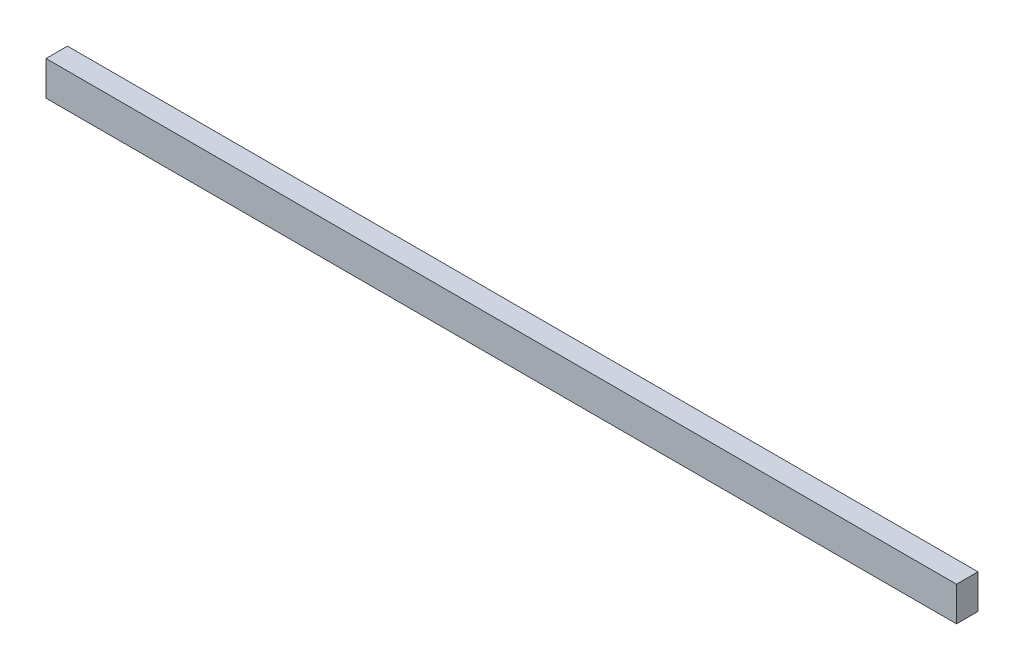
ISO-10303-21;
HEADER;
FILE_DESCRIPTION(('STEP AP214'),'2;1');
FILE_NAME('part.step','',(''),(''),'','','');
FILE_SCHEMA(('AUTOMOTIVE_DESIGN { 1 0 10303 214 1 1 1 1 }'));
ENDSEC;
DATA;
#1=APPLICATION_CONTEXT('core data for automotive mechanical design processes');
#2=APPLICATION_PROTOCOL_DEFINITION('international standard','automotive_design',2000,#1);
#3=PRODUCT_CONTEXT('',#1,'mechanical');
#4=PRODUCT('Part','Part','',(#3));
#5=PRODUCT_RELATED_PRODUCT_CATEGORY('part','',(#4));
#6=PRODUCT_DEFINITION_FORMATION('','',#4);
#7=PRODUCT_DEFINITION_CONTEXT('part definition',#1,'design');
#8=PRODUCT_DEFINITION('design','',#6,#7);
#9=PRODUCT_DEFINITION_SHAPE('','',#8);
#10=(LENGTH_UNIT() NAMED_UNIT(*) SI_UNIT(.MILLI.,.METRE.));
#11=(NAMED_UNIT(*) PLANE_ANGLE_UNIT() SI_UNIT($,.RADIAN.));
#12=(NAMED_UNIT(*) SI_UNIT($,.STERADIAN.) SOLID_ANGLE_UNIT());
#13=UNCERTAINTY_MEASURE_WITH_UNIT(LENGTH_MEASURE(1.E-05),#10,'distance_accuracy_value','');
#14=(GEOMETRIC_REPRESENTATION_CONTEXT(3) GLOBAL_UNCERTAINTY_ASSIGNED_CONTEXT((#13)) GLOBAL_UNIT_ASSIGNED_CONTEXT((#10,
#11,#12)) REPRESENTATION_CONTEXT('',''));
#15=CARTESIAN_POINT('',(0.,0.,0.));
#16=DIRECTION('',(0.,0.,1.));
#17=DIRECTION('',(1.,0.,0.));
#18=AXIS2_PLACEMENT_3D('',#15,#16,#17);
#19=CARTESIAN_POINT('',(530.,40.,12.5));
#20=DIRECTION('',(-1.,0.,0.));
#21=DIRECTION('',(0.,0.,1.));
#22=AXIS2_PLACEMENT_3D('',#19,#20,#21);
#23=PLANE('',#22);
#24=DIRECTION('',(0.,0.,-1.));
#25=VECTOR('',#24,1.);
#26=CARTESIAN_POINT('',(530.,0.,12.5));
#27=LINE('',#26,#25);
#28=CARTESIAN_POINT('',(530.,0.,12.5));
#29=VERTEX_POINT('',#28);
#30=CARTESIAN_POINT('',(530.,0.,-12.5));
#31=VERTEX_POINT('',#30);
#32=EDGE_CURVE('E102',#29,#31,#27,.T.);
#33=ORIENTED_EDGE('',*,*,#32,.T.);
#34=DIRECTION('',(0.,-1.,0.));
#35=VECTOR('',#34,1.);
#36=CARTESIAN_POINT('',(530.,40.,-12.5));
#37=LINE('',#36,#35);
#38=CARTESIAN_POINT('',(530.,40.,-12.5));
#39=VERTEX_POINT('',#38);
#40=EDGE_CURVE('E11',#39,#31,#37,.T.);
#41=ORIENTED_EDGE('',*,*,#40,.F.);
#42=DIRECTION('',(0.,0.,-1.));
#43=VECTOR('',#42,1.);
#44=CARTESIAN_POINT('',(530.,40.,12.5));
#45=LINE('',#44,#43);
#46=CARTESIAN_POINT('',(530.,40.,12.5));
#47=VERTEX_POINT('',#46);
#48=EDGE_CURVE('E90',#47,#39,#45,.T.);
#49=ORIENTED_EDGE('',*,*,#48,.F.);
#50=DIRECTION('',(0.,-1.,0.));
#51=VECTOR('',#50,1.);
#52=CARTESIAN_POINT('',(530.,40.,12.5));
#53=LINE('',#52,#51);
#54=EDGE_CURVE('E98',#47,#29,#53,.T.);
#55=ORIENTED_EDGE('',*,*,#54,.T.);
#56=EDGE_LOOP('',(#33,#41,#49,#55));
#57=FACE_BOUND('',#56,.T.);
#58=ADVANCED_FACE('F39',(#57),#23,.F.);
#59=CARTESIAN_POINT('',(-530.,40.,-12.5));
#60=DIRECTION('',(0.,0.,1.));
#61=DIRECTION('',(1.,0.,0.));
#62=AXIS2_PLACEMENT_3D('',#59,#60,#61);
#63=PLANE('',#62);
#64=DIRECTION('',(-1.,0.,0.));
#65=VECTOR('',#64,1.);
#66=CARTESIAN_POINT('',(-530.,0.,-12.5));
#67=LINE('',#66,#65);
#68=CARTESIAN_POINT('',(-530.,0.,-12.5));
#69=VERTEX_POINT('',#68);
#70=EDGE_CURVE('E94',#31,#69,#67,.T.);
#71=ORIENTED_EDGE('',*,*,#70,.T.);
#72=DIRECTION('',(0.,-1.,0.));
#73=VECTOR('',#72,1.);
#74=CARTESIAN_POINT('',(-530.,40.,-12.5));
#75=LINE('',#74,#73);
#76=CARTESIAN_POINT('',(-530.,40.,-12.5));
#77=VERTEX_POINT('',#76);
#78=EDGE_CURVE('E47',#77,#69,#75,.T.);
#79=ORIENTED_EDGE('',*,*,#78,.F.);
#80=DIRECTION('',(-1.,0.,0.));
#81=VECTOR('',#80,1.);
#82=CARTESIAN_POINT('',(-530.,40.,-12.5));
#83=LINE('',#82,#81);
#84=EDGE_CURVE('E85',#39,#77,#83,.T.);
#85=ORIENTED_EDGE('',*,*,#84,.F.);
#86=ORIENTED_EDGE('',*,*,#40,.T.);
#87=EDGE_LOOP('',(#71,#79,#85,#86));
#88=FACE_BOUND('',#87,.T.);
#89=ADVANCED_FACE('F93',(#88),#63,.F.);
#90=CARTESIAN_POINT('',(-530.,40.,12.5));
#91=DIRECTION('',(1.,0.,0.));
#92=DIRECTION('',(0.,0.,-1.));
#93=AXIS2_PLACEMENT_3D('',#90,#91,#92);
#94=PLANE('',#93);
#95=DIRECTION('',(0.,0.,1.));
#96=VECTOR('',#95,1.);
#97=CARTESIAN_POINT('',(-530.,0.,12.5));
#98=LINE('',#97,#96);
#99=CARTESIAN_POINT('',(-530.,0.,12.5));
#100=VERTEX_POINT('',#99);
#101=EDGE_CURVE('E72',#69,#100,#98,.T.);
#102=ORIENTED_EDGE('',*,*,#101,.T.);
#103=DIRECTION('',(0.,-1.,0.));
#104=VECTOR('',#103,1.);
#105=CARTESIAN_POINT('',(-530.,40.,12.5));
#106=LINE('',#105,#104);
#107=CARTESIAN_POINT('',(-530.,40.,12.5));
#108=VERTEX_POINT('',#107);
#109=EDGE_CURVE('E95',#108,#100,#106,.T.);
#110=ORIENTED_EDGE('',*,*,#109,.F.);
#111=DIRECTION('',(0.,0.,1.));
#112=VECTOR('',#111,1.);
#113=CARTESIAN_POINT('',(-530.,40.,12.5));
#114=LINE('',#113,#112);
#115=EDGE_CURVE('E88',#77,#108,#114,.T.);
#116=ORIENTED_EDGE('',*,*,#115,.F.);
#117=ORIENTED_EDGE('',*,*,#78,.T.);
#118=EDGE_LOOP('',(#102,#110,#116,#117));
#119=FACE_BOUND('',#118,.T.);
#120=ADVANCED_FACE('F96',(#119),#94,.F.);
#121=CARTESIAN_POINT('',(-530.,40.,12.5));
#122=DIRECTION('',(0.,0.,-1.));
#123=DIRECTION('',(-1.,0.,0.));
#124=AXIS2_PLACEMENT_3D('',#121,#122,#123);
#125=PLANE('',#124);
#126=DIRECTION('',(1.,0.,0.));
#127=VECTOR('',#126,1.);
#128=CARTESIAN_POINT('',(-530.,0.,12.5));
#129=LINE('',#128,#127);
#130=EDGE_CURVE('E78',#100,#29,#129,.T.);
#131=ORIENTED_EDGE('',*,*,#130,.T.);
#132=ORIENTED_EDGE('',*,*,#54,.F.);
#133=DIRECTION('',(1.,0.,0.));
#134=VECTOR('',#133,1.);
#135=CARTESIAN_POINT('',(-530.,40.,12.5));
#136=LINE('',#135,#134);
#137=EDGE_CURVE('E55',#108,#47,#136,.T.);
#138=ORIENTED_EDGE('',*,*,#137,.F.);
#139=ORIENTED_EDGE('',*,*,#109,.T.);
#140=EDGE_LOOP('',(#131,#132,#138,#139));
#141=FACE_BOUND('',#140,.T.);
#142=ADVANCED_FACE('F109',(#141),#125,.F.);
#143=CARTESIAN_POINT('',(0.,40.,0.));
#144=DIRECTION('',(0.,-1.,0.));
#145=DIRECTION('',(0.,0.,-1.));
#146=AXIS2_PLACEMENT_3D('',#143,#144,#145);
#147=PLANE('',#146);
#148=ORIENTED_EDGE('',*,*,#48,.T.);
#149=ORIENTED_EDGE('',*,*,#84,.T.);
#150=ORIENTED_EDGE('',*,*,#115,.T.);
#151=ORIENTED_EDGE('',*,*,#137,.T.);
#152=EDGE_LOOP('',(#148,#149,#150,#151));
#153=FACE_BOUND('',#152,.T.);
#154=ADVANCED_FACE('F86',(#153),#147,.F.);
#155=CARTESIAN_POINT('',(0.,0.,0.));
#156=DIRECTION('',(0.,-1.,0.));
#157=DIRECTION('',(0.,0.,-1.));
#158=AXIS2_PLACEMENT_3D('',#155,#156,#157);
#159=PLANE('',#158);
#160=ORIENTED_EDGE('',*,*,#32,.F.);
#161=ORIENTED_EDGE('',*,*,#130,.F.);
#162=ORIENTED_EDGE('',*,*,#101,.F.);
#163=ORIENTED_EDGE('',*,*,#70,.F.);
#164=EDGE_LOOP('',(#160,#161,#162,#163));
#165=FACE_BOUND('',#164,.T.);
#166=ADVANCED_FACE('F112',(#165),#159,.T.);
#167=CLOSED_SHELL('',(#58,#89,#120,#142,#154,#166));
#168=MANIFOLD_SOLID_BREP('B2',#167);
#169=ADVANCED_BREP_SHAPE_REPRESENTATION('',(#18,#168),#14);
#170=SHAPE_DEFINITION_REPRESENTATION(#9,#169);
ENDSEC;
END-ISO-10303-21;
